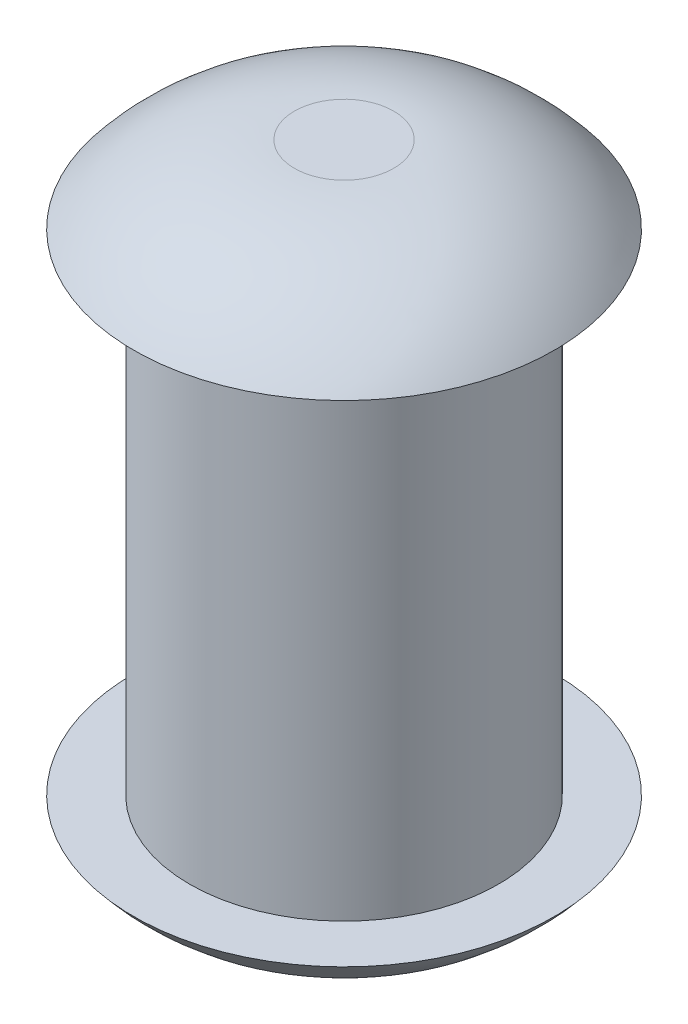
ISO-10303-21;
HEADER;
FILE_DESCRIPTION(('STEP AP214'),'2;1');
FILE_NAME('part.step','',(''),(''),'','','');
FILE_SCHEMA(('AUTOMOTIVE_DESIGN { 1 0 10303 214 1 1 1 1 }'));
ENDSEC;
DATA;
#1=APPLICATION_CONTEXT('core data for automotive mechanical design processes');
#2=APPLICATION_PROTOCOL_DEFINITION('international standard','automotive_design',2000,#1);
#3=PRODUCT_CONTEXT('',#1,'mechanical');
#4=PRODUCT('Part','Part','',(#3));
#5=PRODUCT_RELATED_PRODUCT_CATEGORY('part','',(#4));
#6=PRODUCT_DEFINITION_FORMATION('','',#4);
#7=PRODUCT_DEFINITION_CONTEXT('part definition',#1,'design');
#8=PRODUCT_DEFINITION('design','',#6,#7);
#9=PRODUCT_DEFINITION_SHAPE('','',#8);
#10=(LENGTH_UNIT() NAMED_UNIT(*) SI_UNIT(.MILLI.,.METRE.));
#11=(NAMED_UNIT(*) PLANE_ANGLE_UNIT() SI_UNIT($,.RADIAN.));
#12=(NAMED_UNIT(*) SI_UNIT($,.STERADIAN.) SOLID_ANGLE_UNIT());
#13=UNCERTAINTY_MEASURE_WITH_UNIT(LENGTH_MEASURE(1.E-05),#10,'distance_accuracy_value','');
#14=(GEOMETRIC_REPRESENTATION_CONTEXT(3) GLOBAL_UNCERTAINTY_ASSIGNED_CONTEXT((#13)) GLOBAL_UNIT_ASSIGNED_CONTEXT((#10,
#11,#12)) REPRESENTATION_CONTEXT('',''));
#15=CARTESIAN_POINT('',(0.,0.,0.));
#16=DIRECTION('',(0.,0.,1.));
#17=DIRECTION('',(1.,0.,0.));
#18=AXIS2_PLACEMENT_3D('',#15,#16,#17);
#19=CARTESIAN_POINT('',(0.,9.53,0.));
#20=DIRECTION('',(0.,-1.,0.));
#21=DIRECTION('',(0.,0.,1.));
#22=AXIS2_PLACEMENT_3D('',#19,#20,#21);
#23=CYLINDRICAL_SURFACE('',#22,3.);
#24=CARTESIAN_POINT('',(0.,9.53,0.));
#25=DIRECTION('',(0.,-1.,0.));
#26=DIRECTION('',(0.,0.,-1.));
#27=AXIS2_PLACEMENT_3D('',#24,#25,#26);
#28=CIRCLE('',#27,3.);
#29=CARTESIAN_POINT('',(0.,9.53,-3.));
#30=VERTEX_POINT('',#29);
#31=EDGE_CURVE('E40',#30,#30,#28,.T.);
#32=ORIENTED_EDGE('',*,*,#31,.T.);
#33=EDGE_LOOP('',(#32));
#34=FACE_BOUND('',#33,.T.);
#35=CARTESIAN_POINT('',(0.,0.,0.));
#36=DIRECTION('',(0.,-1.,0.));
#37=DIRECTION('',(0.,0.,-1.));
#38=AXIS2_PLACEMENT_3D('',#35,#36,#37);
#39=CIRCLE('',#38,3.);
#40=CARTESIAN_POINT('',(0.,0.,-3.));
#41=VERTEX_POINT('',#40);
#42=EDGE_CURVE('E53',#41,#41,#39,.T.);
#43=ORIENTED_EDGE('',*,*,#42,.F.);
#44=EDGE_LOOP('',(#43));
#45=FACE_BOUND('',#44,.T.);
#46=ADVANCED_FACE('F33',(#34,#45),#23,.T.);
#47=CARTESIAN_POINT('',(0.,9.53,0.));
#48=DIRECTION('',(0.,1.,0.));
#49=DIRECTION('',(0.,0.,-1.));
#50=AXIS2_PLACEMENT_3D('',#47,#48,#49);
#51=PLANE('',#50);
#52=CARTESIAN_POINT('',(0.,9.53,0.));
#53=DIRECTION('',(0.,-1.,0.));
#54=DIRECTION('',(0.,0.,-1.));
#55=AXIS2_PLACEMENT_3D('',#52,#53,#54);
#56=CIRCLE('',#55,4.08679671539911);
#57=CARTESIAN_POINT('',(0.,9.53,-4.08679671539911));
#58=VERTEX_POINT('',#57);
#59=EDGE_CURVE('E44',#58,#58,#56,.T.);
#60=ORIENTED_EDGE('',*,*,#59,.T.);
#61=EDGE_LOOP('',(#60));
#62=FACE_BOUND('',#61,.T.);
#63=ORIENTED_EDGE('',*,*,#31,.F.);
#64=EDGE_LOOP('',(#63));
#65=FACE_BOUND('',#64,.T.);
#66=ADVANCED_FACE('F71',(#62,#65),#51,.F.);
#67=CARTESIAN_POINT('',(0.,11.03,0.));
#68=DIRECTION('',(0.,1.,0.));
#69=DIRECTION('',(0.,0.,-1.));
#70=AXIS2_PLACEMENT_3D('',#67,#68,#69);
#71=PLANE('',#70);
#72=CARTESIAN_POINT('',(0.,11.03,0.));
#73=DIRECTION('',(0.,-1.,0.));
#74=DIRECTION('',(0.,0.,-1.));
#75=AXIS2_PLACEMENT_3D('',#72,#73,#74);
#76=CIRCLE('',#75,0.964297716199907);
#77=CARTESIAN_POINT('',(0.,11.03,-0.964297716199907));
#78=VERTEX_POINT('',#77);
#79=EDGE_CURVE('E10',#78,#78,#76,.T.);
#80=ORIENTED_EDGE('',*,*,#79,.F.);
#81=EDGE_LOOP('',(#80));
#82=FACE_BOUND('',#81,.T.);
#83=ADVANCED_FACE('F75',(#82),#71,.T.);
#84=CARTESIAN_POINT('',(0.,7.03,0.));
#85=DIRECTION('',(0.,-1.,0.));
#86=DIRECTION('',(0.,0.,1.));
#87=AXIS2_PLACEMENT_3D('',#84,#85,#86);
#88=DEGENERATE_TOROIDAL_SURFACE('',#87,0.964297716199907,4.,.T.);
#89=ORIENTED_EDGE('',*,*,#59,.F.);
#90=EDGE_LOOP('',(#89));
#91=FACE_BOUND('',#90,.T.);
#92=ORIENTED_EDGE('',*,*,#79,.T.);
#93=EDGE_LOOP('',(#92));
#94=FACE_BOUND('',#93,.T.);
#95=ADVANCED_FACE('F35',(#91,#94),#88,.T.);
#96=CARTESIAN_POINT('',(0.,0.,0.));
#97=DIRECTION('',(0.,-1.,0.));
#98=DIRECTION('',(0.,0.,-1.));
#99=AXIS2_PLACEMENT_3D('',#96,#97,#98);
#100=PLANE('',#99);
#101=CARTESIAN_POINT('',(0.,0.,0.));
#102=DIRECTION('',(0.,-1.,0.));
#103=DIRECTION('',(0.,0.,-1.));
#104=AXIS2_PLACEMENT_3D('',#101,#102,#103);
#105=CIRCLE('',#104,4.08679671539911);
#106=CARTESIAN_POINT('',(0.,0.,-4.08679671539911));
#107=VERTEX_POINT('',#106);
#108=EDGE_CURVE('E56',#107,#107,#105,.T.);
#109=ORIENTED_EDGE('',*,*,#108,.F.);
#110=EDGE_LOOP('',(#109));
#111=FACE_BOUND('',#110,.T.);
#112=ORIENTED_EDGE('',*,*,#42,.T.);
#113=EDGE_LOOP('',(#112));
#114=FACE_BOUND('',#113,.T.);
#115=ADVANCED_FACE('F63',(#111,#114),#100,.F.);
#116=CARTESIAN_POINT('',(0.,-1.5,0.));
#117=DIRECTION('',(0.,-1.,0.));
#118=DIRECTION('',(0.,0.,-1.));
#119=AXIS2_PLACEMENT_3D('',#116,#117,#118);
#120=PLANE('',#119);
#121=CARTESIAN_POINT('',(0.,-1.5,0.));
#122=DIRECTION('',(0.,-1.,0.));
#123=DIRECTION('',(0.,0.,-1.));
#124=AXIS2_PLACEMENT_3D('',#121,#122,#123);
#125=CIRCLE('',#124,0.964297716199907);
#126=CARTESIAN_POINT('',(0.,-1.5,-0.964297716199907));
#127=VERTEX_POINT('',#126);
#128=EDGE_CURVE('E48',#127,#127,#125,.T.);
#129=ORIENTED_EDGE('',*,*,#128,.T.);
#130=EDGE_LOOP('',(#129));
#131=FACE_BOUND('',#130,.T.);
#132=ADVANCED_FACE('F66',(#131),#120,.T.);
#133=CARTESIAN_POINT('',(0.,2.5,0.));
#134=DIRECTION('',(0.,1.,0.));
#135=DIRECTION('',(0.,0.,1.));
#136=AXIS2_PLACEMENT_3D('',#133,#134,#135);
#137=DEGENERATE_TOROIDAL_SURFACE('',#136,0.964297716199907,4.,.T.);
#138=ORIENTED_EDGE('',*,*,#108,.T.);
#139=EDGE_LOOP('',(#138));
#140=FACE_BOUND('',#139,.T.);
#141=ORIENTED_EDGE('',*,*,#128,.F.);
#142=EDGE_LOOP('',(#141));
#143=FACE_BOUND('',#142,.T.);
#144=ADVANCED_FACE('F60',(#140,#143),#137,.T.);
#145=CLOSED_SHELL('',(#46,#66,#83,#95,#115,#132,#144));
#146=MANIFOLD_SOLID_BREP('B2',#145);
#147=ADVANCED_BREP_SHAPE_REPRESENTATION('',(#18,#146),#14);
#148=SHAPE_DEFINITION_REPRESENTATION(#9,#147);
ENDSEC;
END-ISO-10303-21;
